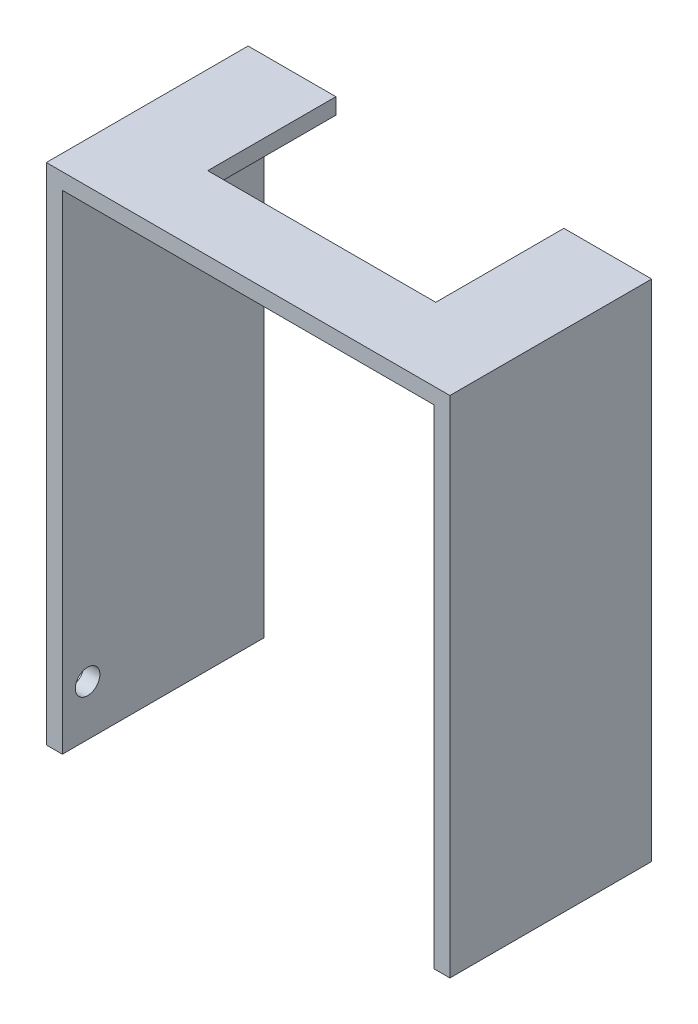
ISO-10303-21;
HEADER;
FILE_DESCRIPTION(('STEP AP214'),'2;1');
FILE_NAME('part.step','',(''),(''),'','','');
FILE_SCHEMA(('AUTOMOTIVE_DESIGN { 1 0 10303 214 1 1 1 1 }'));
ENDSEC;
DATA;
#1=APPLICATION_CONTEXT('core data for automotive mechanical design processes');
#2=APPLICATION_PROTOCOL_DEFINITION('international standard','automotive_design',2000,#1);
#3=PRODUCT_CONTEXT('',#1,'mechanical');
#4=PRODUCT('Part','Part','',(#3));
#5=PRODUCT_RELATED_PRODUCT_CATEGORY('part','',(#4));
#6=PRODUCT_DEFINITION_FORMATION('','',#4);
#7=PRODUCT_DEFINITION_CONTEXT('part definition',#1,'design');
#8=PRODUCT_DEFINITION('design','',#6,#7);
#9=PRODUCT_DEFINITION_SHAPE('','',#8);
#10=(LENGTH_UNIT() NAMED_UNIT(*) SI_UNIT(.MILLI.,.METRE.));
#11=(NAMED_UNIT(*) PLANE_ANGLE_UNIT() SI_UNIT($,.RADIAN.));
#12=(NAMED_UNIT(*) SI_UNIT($,.STERADIAN.) SOLID_ANGLE_UNIT());
#13=UNCERTAINTY_MEASURE_WITH_UNIT(LENGTH_MEASURE(1.E-05),#10,'distance_accuracy_value','');
#14=(GEOMETRIC_REPRESENTATION_CONTEXT(3) GLOBAL_UNCERTAINTY_ASSIGNED_CONTEXT((#13)) GLOBAL_UNIT_ASSIGNED_CONTEXT((#10,
#11,#12)) REPRESENTATION_CONTEXT('',''));
#15=CARTESIAN_POINT('',(0.,0.,0.));
#16=DIRECTION('',(0.,0.,1.));
#17=DIRECTION('',(1.,0.,0.));
#18=AXIS2_PLACEMENT_3D('',#15,#16,#17);
#19=CARTESIAN_POINT('',(1.59,-50.,20.));
#20=DIRECTION('',(-1.,0.,0.));
#21=DIRECTION('',(0.,0.,1.));
#22=AXIS2_PLACEMENT_3D('',#19,#20,#21);
#23=PLANE('',#22);
#24=CARTESIAN_POINT('',(1.59,-5.,2.5));
#25=DIRECTION('',(-1.,0.,0.));
#26=DIRECTION('',(0.,0.,1.));
#27=AXIS2_PLACEMENT_3D('',#24,#25,#26);
#28=CIRCLE('',#27,1.21919999999999);
#29=CARTESIAN_POINT('',(1.59,-5.,3.71919999999999));
#30=VERTEX_POINT('',#29);
#31=EDGE_CURVE('E303',#30,#30,#28,.F.);
#32=ORIENTED_EDGE('',*,*,#31,.F.);
#33=EDGE_LOOP('',(#32));
#34=FACE_BOUND('',#33,.T.);
#35=DIRECTION('',(0.,1.,0.));
#36=VECTOR('',#35,1.);
#37=CARTESIAN_POINT('',(1.59,-50.,0.));
#38=LINE('',#37,#36);
#39=CARTESIAN_POINT('',(1.59,-50.,0.));
#40=VERTEX_POINT('',#39);
#41=CARTESIAN_POINT('',(1.59,-1.59,0.));
#42=VERTEX_POINT('',#41);
#43=EDGE_CURVE('E147',#40,#42,#38,.T.);
#44=ORIENTED_EDGE('',*,*,#43,.T.);
#45=DIRECTION('',(0.,0.,-1.));
#46=VECTOR('',#45,1.);
#47=CARTESIAN_POINT('',(1.59,-1.59,20.));
#48=LINE('',#47,#46);
#49=CARTESIAN_POINT('',(1.59,-1.59,20.));
#50=VERTEX_POINT('',#49);
#51=EDGE_CURVE('E173',#50,#42,#48,.T.);
#52=ORIENTED_EDGE('',*,*,#51,.F.);
#53=DIRECTION('',(0.,1.,0.));
#54=VECTOR('',#53,1.);
#55=CARTESIAN_POINT('',(1.59,-50.,20.));
#56=LINE('',#55,#54);
#57=CARTESIAN_POINT('',(1.59,-50.,20.));
#58=VERTEX_POINT('',#57);
#59=EDGE_CURVE('E100',#58,#50,#56,.T.);
#60=ORIENTED_EDGE('',*,*,#59,.F.);
#61=DIRECTION('',(0.,0.,-1.));
#62=VECTOR('',#61,1.);
#63=CARTESIAN_POINT('',(1.59,-50.,20.));
#64=LINE('',#63,#62);
#65=EDGE_CURVE('E176',#58,#40,#64,.T.);
#66=ORIENTED_EDGE('',*,*,#65,.T.);
#67=EDGE_LOOP('',(#44,#52,#60,#66));
#68=FACE_BOUND('',#67,.T.);
#69=CARTESIAN_POINT('',(1.59,-45.,17.5));
#70=DIRECTION('',(-1.,0.,0.));
#71=DIRECTION('',(0.,0.,1.));
#72=AXIS2_PLACEMENT_3D('',#69,#70,#71);
#73=CIRCLE('',#72,1.21919999999999);
#74=CARTESIAN_POINT('',(1.59,-45.,18.7192));
#75=VERTEX_POINT('',#74);
#76=EDGE_CURVE('E310',#75,#75,#73,.F.);
#77=ORIENTED_EDGE('',*,*,#76,.F.);
#78=EDGE_LOOP('',(#77));
#79=FACE_BOUND('',#78,.T.);
#80=ADVANCED_FACE('F34',(#34,#68,#79),#23,.F.);
#81=CARTESIAN_POINT('',(0.,0.,0.));
#82=DIRECTION('',(0.,0.,1.));
#83=DIRECTION('',(1.,0.,0.));
#84=AXIS2_PLACEMENT_3D('',#81,#82,#83);
#85=PLANE('',#84);
#86=DIRECTION('',(1.,0.,0.));
#87=VECTOR('',#86,1.);
#88=CARTESIAN_POINT('',(1.59,-1.59,0.));
#89=LINE('',#88,#87);
#90=CARTESIAN_POINT('',(31.3,-1.59,0.));
#91=VERTEX_POINT('',#90);
#92=CARTESIAN_POINT('',(38.41,-1.59,0.));
#93=VERTEX_POINT('',#92);
#94=EDGE_CURVE('E150',#91,#93,#89,.T.);
#95=ORIENTED_EDGE('',*,*,#94,.F.);
#96=DIRECTION('',(0.,1.,0.));
#97=VECTOR('',#96,1.);
#98=CARTESIAN_POINT('',(31.3,0.,0.));
#99=LINE('',#98,#97);
#100=CARTESIAN_POINT('',(31.3,0.,0.));
#101=VERTEX_POINT('',#100);
#102=EDGE_CURVE('E11',#91,#101,#99,.T.);
#103=ORIENTED_EDGE('',*,*,#102,.T.);
#104=DIRECTION('',(-1.,0.,0.));
#105=VECTOR('',#104,1.);
#106=CARTESIAN_POINT('',(0.,0.,0.));
#107=LINE('',#106,#105);
#108=CARTESIAN_POINT('',(40.,0.,0.));
#109=VERTEX_POINT('',#108);
#110=EDGE_CURVE('E160',#109,#101,#107,.T.);
#111=ORIENTED_EDGE('',*,*,#110,.F.);
#112=DIRECTION('',(0.,1.,0.));
#113=VECTOR('',#112,1.);
#114=CARTESIAN_POINT('',(40.,0.,0.));
#115=LINE('',#114,#113);
#116=CARTESIAN_POINT('',(40.,-50.,0.));
#117=VERTEX_POINT('',#116);
#118=EDGE_CURVE('E131',#117,#109,#115,.T.);
#119=ORIENTED_EDGE('',*,*,#118,.F.);
#120=DIRECTION('',(1.,0.,0.));
#121=VECTOR('',#120,1.);
#122=CARTESIAN_POINT('',(38.41,-50.,0.));
#123=LINE('',#122,#121);
#124=CARTESIAN_POINT('',(38.41,-50.,0.));
#125=VERTEX_POINT('',#124);
#126=EDGE_CURVE('E156',#125,#117,#123,.T.);
#127=ORIENTED_EDGE('',*,*,#126,.F.);
#128=DIRECTION('',(0.,-1.,0.));
#129=VECTOR('',#128,1.);
#130=CARTESIAN_POINT('',(38.41,-1.59,0.));
#131=LINE('',#130,#129);
#132=EDGE_CURVE('E154',#93,#125,#131,.T.);
#133=ORIENTED_EDGE('',*,*,#132,.F.);
#134=EDGE_LOOP('',(#95,#103,#111,#119,#127,#133));
#135=FACE_BOUND('',#134,.T.);
#136=ADVANCED_FACE('F211',(#135),#85,.F.);
#137=CARTESIAN_POINT('',(0.,-50.,20.));
#138=DIRECTION('',(0.,1.,0.));
#139=DIRECTION('',(0.,0.,1.));
#140=AXIS2_PLACEMENT_3D('',#137,#138,#139);
#141=PLANE('',#140);
#142=DIRECTION('',(1.,0.,0.));
#143=VECTOR('',#142,1.);
#144=CARTESIAN_POINT('',(0.,-50.,0.));
#145=LINE('',#144,#143);
#146=CARTESIAN_POINT('',(0.,-50.,0.));
#147=VERTEX_POINT('',#146);
#148=EDGE_CURVE('E144',#147,#40,#145,.T.);
#149=ORIENTED_EDGE('',*,*,#148,.T.);
#150=ORIENTED_EDGE('',*,*,#65,.F.);
#151=DIRECTION('',(1.,0.,0.));
#152=VECTOR('',#151,1.);
#153=CARTESIAN_POINT('',(0.,-50.,20.));
#154=LINE('',#153,#152);
#155=CARTESIAN_POINT('',(0.,-50.,20.));
#156=VERTEX_POINT('',#155);
#157=EDGE_CURVE('E163',#156,#58,#154,.T.);
#158=ORIENTED_EDGE('',*,*,#157,.F.);
#159=DIRECTION('',(0.,0.,-1.));
#160=VECTOR('',#159,1.);
#161=CARTESIAN_POINT('',(0.,-50.,20.));
#162=LINE('',#161,#160);
#163=EDGE_CURVE('E140',#156,#147,#162,.T.);
#164=ORIENTED_EDGE('',*,*,#163,.T.);
#165=EDGE_LOOP('',(#149,#150,#158,#164));
#166=FACE_BOUND('',#165,.T.);
#167=ADVANCED_FACE('F36',(#166),#141,.F.);
#168=CARTESIAN_POINT('',(1.59,-1.59,20.));
#169=DIRECTION('',(0.,1.,0.));
#170=DIRECTION('',(0.,0.,1.));
#171=AXIS2_PLACEMENT_3D('',#168,#169,#170);
#172=PLANE('',#171);
#173=DIRECTION('',(1.,0.,0.));
#174=VECTOR('',#173,1.);
#175=CARTESIAN_POINT('',(1.59,-1.59,12.7));
#176=LINE('',#175,#174);
#177=CARTESIAN_POINT('',(8.7,-1.59,12.7));
#178=VERTEX_POINT('',#177);
#179=CARTESIAN_POINT('',(31.3,-1.59,12.7));
#180=VERTEX_POINT('',#179);
#181=EDGE_CURVE('E148',#178,#180,#176,.T.);
#182=ORIENTED_EDGE('',*,*,#181,.T.);
#183=DIRECTION('',(0.,0.,-1.));
#184=VECTOR('',#183,1.);
#185=CARTESIAN_POINT('',(31.3,-1.59,20.));
#186=LINE('',#185,#184);
#187=EDGE_CURVE('E330',#180,#91,#186,.T.);
#188=ORIENTED_EDGE('',*,*,#187,.T.);
#189=ORIENTED_EDGE('',*,*,#94,.T.);
#190=DIRECTION('',(0.,0.,-1.));
#191=VECTOR('',#190,1.);
#192=CARTESIAN_POINT('',(38.41,-1.59,20.));
#193=LINE('',#192,#191);
#194=CARTESIAN_POINT('',(38.41,-1.59,20.));
#195=VERTEX_POINT('',#194);
#196=EDGE_CURVE('E170',#195,#93,#193,.T.);
#197=ORIENTED_EDGE('',*,*,#196,.F.);
#198=DIRECTION('',(1.,0.,0.));
#199=VECTOR('',#198,1.);
#200=CARTESIAN_POINT('',(1.59,-1.59,20.));
#201=LINE('',#200,#199);
#202=EDGE_CURVE('E190',#50,#195,#201,.T.);
#203=ORIENTED_EDGE('',*,*,#202,.F.);
#204=ORIENTED_EDGE('',*,*,#51,.T.);
#205=CARTESIAN_POINT('',(8.7,-1.59,0.));
#206=VERTEX_POINT('',#205);
#207=EDGE_CURVE('E151',#42,#206,#89,.T.);
#208=ORIENTED_EDGE('',*,*,#207,.T.);
#209=DIRECTION('',(0.,0.,1.));
#210=VECTOR('',#209,1.);
#211=CARTESIAN_POINT('',(8.7,-1.59,20.));
#212=LINE('',#211,#210);
#213=EDGE_CURVE('E49',#206,#178,#212,.T.);
#214=ORIENTED_EDGE('',*,*,#213,.T.);
#215=EDGE_LOOP('',(#182,#188,#189,#197,#203,#204,#208,#214));
#216=FACE_BOUND('',#215,.T.);
#217=ADVANCED_FACE('F186',(#216),#172,.F.);
#218=CARTESIAN_POINT('',(38.41,-1.59,20.));
#219=DIRECTION('',(1.,0.,0.));
#220=DIRECTION('',(0.,1.,0.));
#221=AXIS2_PLACEMENT_3D('',#218,#219,#220);
#222=PLANE('',#221);
#223=ORIENTED_EDGE('',*,*,#132,.T.);
#224=DIRECTION('',(0.,0.,-1.));
#225=VECTOR('',#224,1.);
#226=CARTESIAN_POINT('',(38.41,-50.,20.));
#227=LINE('',#226,#225);
#228=CARTESIAN_POINT('',(38.41,-50.,20.));
#229=VERTEX_POINT('',#228);
#230=EDGE_CURVE('E167',#229,#125,#227,.T.);
#231=ORIENTED_EDGE('',*,*,#230,.F.);
#232=DIRECTION('',(0.,-1.,0.));
#233=VECTOR('',#232,1.);
#234=CARTESIAN_POINT('',(38.41,-1.59,20.));
#235=LINE('',#234,#233);
#236=EDGE_CURVE('E337',#195,#229,#235,.T.);
#237=ORIENTED_EDGE('',*,*,#236,.F.);
#238=ORIENTED_EDGE('',*,*,#196,.T.);
#239=EDGE_LOOP('',(#223,#231,#237,#238));
#240=FACE_BOUND('',#239,.T.);
#241=ADVANCED_FACE('F222',(#240),#222,.F.);
#242=CARTESIAN_POINT('',(38.41,-50.,20.));
#243=DIRECTION('',(0.,1.,0.));
#244=DIRECTION('',(0.,0.,1.));
#245=AXIS2_PLACEMENT_3D('',#242,#243,#244);
#246=PLANE('',#245);
#247=ORIENTED_EDGE('',*,*,#126,.T.);
#248=DIRECTION('',(0.,0.,-1.));
#249=VECTOR('',#248,1.);
#250=CARTESIAN_POINT('',(40.,-50.,20.));
#251=LINE('',#250,#249);
#252=CARTESIAN_POINT('',(40.,-50.,20.));
#253=VERTEX_POINT('',#252);
#254=EDGE_CURVE('E135',#253,#117,#251,.T.);
#255=ORIENTED_EDGE('',*,*,#254,.F.);
#256=DIRECTION('',(1.,0.,0.));
#257=VECTOR('',#256,1.);
#258=CARTESIAN_POINT('',(38.41,-50.,20.));
#259=LINE('',#258,#257);
#260=EDGE_CURVE('E122',#229,#253,#259,.T.);
#261=ORIENTED_EDGE('',*,*,#260,.F.);
#262=ORIENTED_EDGE('',*,*,#230,.T.);
#263=EDGE_LOOP('',(#247,#255,#261,#262));
#264=FACE_BOUND('',#263,.T.);
#265=ADVANCED_FACE('F225',(#264),#246,.F.);
#266=CARTESIAN_POINT('',(40.,0.,20.));
#267=DIRECTION('',(-1.,0.,0.));
#268=DIRECTION('',(0.,-1.,0.));
#269=AXIS2_PLACEMENT_3D('',#266,#267,#268);
#270=PLANE('',#269);
#271=ORIENTED_EDGE('',*,*,#118,.T.);
#272=DIRECTION('',(0.,0.,-1.));
#273=VECTOR('',#272,1.);
#274=CARTESIAN_POINT('',(40.,0.,20.));
#275=LINE('',#274,#273);
#276=CARTESIAN_POINT('',(40.,0.,20.));
#277=VERTEX_POINT('',#276);
#278=EDGE_CURVE('E128',#277,#109,#275,.T.);
#279=ORIENTED_EDGE('',*,*,#278,.F.);
#280=DIRECTION('',(0.,1.,0.));
#281=VECTOR('',#280,1.);
#282=CARTESIAN_POINT('',(40.,0.,20.));
#283=LINE('',#282,#281);
#284=EDGE_CURVE('E115',#253,#277,#283,.T.);
#285=ORIENTED_EDGE('',*,*,#284,.F.);
#286=ORIENTED_EDGE('',*,*,#254,.T.);
#287=EDGE_LOOP('',(#271,#279,#285,#286));
#288=FACE_BOUND('',#287,.T.);
#289=ADVANCED_FACE('F129',(#288),#270,.F.);
#290=CARTESIAN_POINT('',(0.,0.,20.));
#291=DIRECTION('',(0.,-1.,0.));
#292=DIRECTION('',(0.,0.,-1.));
#293=AXIS2_PLACEMENT_3D('',#290,#291,#292);
#294=PLANE('',#293);
#295=ORIENTED_EDGE('',*,*,#110,.T.);
#296=DIRECTION('',(0.,0.,-1.));
#297=VECTOR('',#296,1.);
#298=CARTESIAN_POINT('',(31.3,0.,12.7));
#299=LINE('',#298,#297);
#300=CARTESIAN_POINT('',(31.3,0.,12.7));
#301=VERTEX_POINT('',#300);
#302=EDGE_CURVE('E320',#301,#101,#299,.T.);
#303=ORIENTED_EDGE('',*,*,#302,.F.);
#304=DIRECTION('',(1.,0.,0.));
#305=VECTOR('',#304,1.);
#306=CARTESIAN_POINT('',(8.7,0.,12.7));
#307=LINE('',#306,#305);
#308=CARTESIAN_POINT('',(8.7,0.,12.7));
#309=VERTEX_POINT('',#308);
#310=EDGE_CURVE('E317',#309,#301,#307,.T.);
#311=ORIENTED_EDGE('',*,*,#310,.F.);
#312=DIRECTION('',(0.,0.,1.));
#313=VECTOR('',#312,1.);
#314=CARTESIAN_POINT('',(8.7,0.,0.));
#315=LINE('',#314,#313);
#316=CARTESIAN_POINT('',(8.7,0.,0.));
#317=VERTEX_POINT('',#316);
#318=EDGE_CURVE('E313',#317,#309,#315,.T.);
#319=ORIENTED_EDGE('',*,*,#318,.F.);
#320=CARTESIAN_POINT('',(0.,0.,0.));
#321=VERTEX_POINT('',#320);
#322=EDGE_CURVE('E159',#317,#321,#107,.T.);
#323=ORIENTED_EDGE('',*,*,#322,.T.);
#324=DIRECTION('',(0.,0.,-1.));
#325=VECTOR('',#324,1.);
#326=CARTESIAN_POINT('',(0.,0.,20.));
#327=LINE('',#326,#325);
#328=CARTESIAN_POINT('',(0.,0.,20.));
#329=VERTEX_POINT('',#328);
#330=EDGE_CURVE('E136',#329,#321,#327,.T.);
#331=ORIENTED_EDGE('',*,*,#330,.F.);
#332=DIRECTION('',(-1.,0.,0.));
#333=VECTOR('',#332,1.);
#334=CARTESIAN_POINT('',(0.,0.,20.));
#335=LINE('',#334,#333);
#336=EDGE_CURVE('E119',#277,#329,#335,.T.);
#337=ORIENTED_EDGE('',*,*,#336,.F.);
#338=ORIENTED_EDGE('',*,*,#278,.T.);
#339=EDGE_LOOP('',(#295,#303,#311,#319,#323,#331,#337,#338));
#340=FACE_BOUND('',#339,.T.);
#341=ADVANCED_FACE('F138',(#340),#294,.F.);
#342=CARTESIAN_POINT('',(0.,-50.,20.));
#343=DIRECTION('',(1.,0.,0.));
#344=DIRECTION('',(0.,0.,-1.));
#345=AXIS2_PLACEMENT_3D('',#342,#343,#344);
#346=PLANE('',#345);
#347=CARTESIAN_POINT('',(0.,-5.,2.5));
#348=DIRECTION('',(-1.,0.,0.));
#349=DIRECTION('',(0.,0.,1.));
#350=AXIS2_PLACEMENT_3D('',#347,#348,#349);
#351=CIRCLE('',#350,1.21919999999999);
#352=CARTESIAN_POINT('',(0.,-5.,3.71919999999999));
#353=VERTEX_POINT('',#352);
#354=EDGE_CURVE('E305',#353,#353,#351,.T.);
#355=ORIENTED_EDGE('',*,*,#354,.F.);
#356=EDGE_LOOP('',(#355));
#357=FACE_BOUND('',#356,.T.);
#358=CARTESIAN_POINT('',(0.,-45.,17.5));
#359=DIRECTION('',(-1.,0.,0.));
#360=DIRECTION('',(0.,0.,1.));
#361=AXIS2_PLACEMENT_3D('',#358,#359,#360);
#362=CIRCLE('',#361,1.21919999999999);
#363=CARTESIAN_POINT('',(0.,-45.,18.7192));
#364=VERTEX_POINT('',#363);
#365=EDGE_CURVE('E307',#364,#364,#362,.T.);
#366=ORIENTED_EDGE('',*,*,#365,.F.);
#367=EDGE_LOOP('',(#366));
#368=FACE_BOUND('',#367,.T.);
#369=DIRECTION('',(0.,-1.,0.));
#370=VECTOR('',#369,1.);
#371=CARTESIAN_POINT('',(0.,-50.,0.));
#372=LINE('',#371,#370);
#373=EDGE_CURVE('E91',#321,#147,#372,.T.);
#374=ORIENTED_EDGE('',*,*,#373,.T.);
#375=ORIENTED_EDGE('',*,*,#163,.F.);
#376=DIRECTION('',(0.,-1.,0.));
#377=VECTOR('',#376,1.);
#378=CARTESIAN_POINT('',(0.,-50.,20.));
#379=LINE('',#378,#377);
#380=EDGE_CURVE('E58',#329,#156,#379,.T.);
#381=ORIENTED_EDGE('',*,*,#380,.F.);
#382=ORIENTED_EDGE('',*,*,#330,.T.);
#383=EDGE_LOOP('',(#374,#375,#381,#382));
#384=FACE_BOUND('',#383,.T.);
#385=ADVANCED_FACE('F196',(#357,#368,#384),#346,.F.);
#386=CARTESIAN_POINT('',(0.,0.,20.));
#387=DIRECTION('',(0.,0.,1.));
#388=DIRECTION('',(1.,0.,0.));
#389=AXIS2_PLACEMENT_3D('',#386,#387,#388);
#390=PLANE('',#389);
#391=ORIENTED_EDGE('',*,*,#157,.T.);
#392=ORIENTED_EDGE('',*,*,#59,.T.);
#393=ORIENTED_EDGE('',*,*,#202,.T.);
#394=ORIENTED_EDGE('',*,*,#236,.T.);
#395=ORIENTED_EDGE('',*,*,#260,.T.);
#396=ORIENTED_EDGE('',*,*,#284,.T.);
#397=ORIENTED_EDGE('',*,*,#336,.T.);
#398=ORIENTED_EDGE('',*,*,#380,.T.);
#399=EDGE_LOOP('',(#391,#392,#393,#394,#395,#396,#397,#398));
#400=FACE_BOUND('',#399,.T.);
#401=ADVANCED_FACE('F117',(#400),#390,.T.);
#402=ORIENTED_EDGE('',*,*,#322,.F.);
#403=DIRECTION('',(0.,-1.,0.));
#404=VECTOR('',#403,1.);
#405=CARTESIAN_POINT('',(8.7,0.,0.));
#406=LINE('',#405,#404);
#407=EDGE_CURVE('E42',#317,#206,#406,.T.);
#408=ORIENTED_EDGE('',*,*,#407,.T.);
#409=ORIENTED_EDGE('',*,*,#207,.F.);
#410=ORIENTED_EDGE('',*,*,#43,.F.);
#411=ORIENTED_EDGE('',*,*,#148,.F.);
#412=ORIENTED_EDGE('',*,*,#373,.F.);
#413=EDGE_LOOP('',(#402,#408,#409,#410,#411,#412));
#414=FACE_BOUND('',#413,.T.);
#415=ADVANCED_FACE('F180',(#414),#85,.F.);
#416=CARTESIAN_POINT('',(8.7,-10.,12.7));
#417=DIRECTION('',(0.,0.,1.));
#418=DIRECTION('',(1.,0.,0.));
#419=AXIS2_PLACEMENT_3D('',#416,#417,#418);
#420=PLANE('',#419);
#421=DIRECTION('',(0.,1.,0.));
#422=VECTOR('',#421,1.);
#423=CARTESIAN_POINT('',(8.7,-10.,12.7));
#424=LINE('',#423,#422);
#425=EDGE_CURVE('E323',#178,#309,#424,.T.);
#426=ORIENTED_EDGE('',*,*,#425,.T.);
#427=ORIENTED_EDGE('',*,*,#310,.T.);
#428=DIRECTION('',(0.,1.,0.));
#429=VECTOR('',#428,1.);
#430=CARTESIAN_POINT('',(31.3,-10.,12.7));
#431=LINE('',#430,#429);
#432=EDGE_CURVE('E324',#180,#301,#431,.T.);
#433=ORIENTED_EDGE('',*,*,#432,.F.);
#434=ORIENTED_EDGE('',*,*,#181,.F.);
#435=EDGE_LOOP('',(#426,#427,#433,#434));
#436=FACE_BOUND('',#435,.T.);
#437=ADVANCED_FACE('F255',(#436),#420,.F.);
#438=CARTESIAN_POINT('',(31.3,-10.,12.7));
#439=DIRECTION('',(1.,0.,0.));
#440=DIRECTION('',(0.,0.,-1.));
#441=AXIS2_PLACEMENT_3D('',#438,#439,#440);
#442=PLANE('',#441);
#443=ORIENTED_EDGE('',*,*,#432,.T.);
#444=ORIENTED_EDGE('',*,*,#302,.T.);
#445=ORIENTED_EDGE('',*,*,#102,.F.);
#446=ORIENTED_EDGE('',*,*,#187,.F.);
#447=EDGE_LOOP('',(#443,#444,#445,#446));
#448=FACE_BOUND('',#447,.T.);
#449=ADVANCED_FACE('F261',(#448),#442,.F.);
#450=CARTESIAN_POINT('',(8.7,-10.,0.));
#451=DIRECTION('',(-1.,0.,0.));
#452=DIRECTION('',(0.,0.,1.));
#453=AXIS2_PLACEMENT_3D('',#450,#451,#452);
#454=PLANE('',#453);
#455=ORIENTED_EDGE('',*,*,#407,.F.);
#456=ORIENTED_EDGE('',*,*,#318,.T.);
#457=ORIENTED_EDGE('',*,*,#425,.F.);
#458=ORIENTED_EDGE('',*,*,#213,.F.);
#459=EDGE_LOOP('',(#455,#456,#457,#458));
#460=FACE_BOUND('',#459,.T.);
#461=ADVANCED_FACE('F269',(#460),#454,.F.);
#462=CARTESIAN_POINT('',(0.,-45.,17.5));
#463=DIRECTION('',(-1.,0.,0.));
#464=DIRECTION('',(0.,0.,1.));
#465=AXIS2_PLACEMENT_3D('',#462,#463,#464);
#466=CYLINDRICAL_SURFACE('',#465,1.21919999999999);
#467=ORIENTED_EDGE('',*,*,#76,.T.);
#468=EDGE_LOOP('',(#467));
#469=FACE_BOUND('',#468,.T.);
#470=ORIENTED_EDGE('',*,*,#365,.T.);
#471=EDGE_LOOP('',(#470));
#472=FACE_BOUND('',#471,.T.);
#473=ADVANCED_FACE('F276',(#469,#472),#466,.F.);
#474=CARTESIAN_POINT('',(0.,-5.,2.5));
#475=DIRECTION('',(-1.,0.,0.));
#476=DIRECTION('',(0.,0.,1.));
#477=AXIS2_PLACEMENT_3D('',#474,#475,#476);
#478=CYLINDRICAL_SURFACE('',#477,1.21919999999999);
#479=ORIENTED_EDGE('',*,*,#31,.T.);
#480=EDGE_LOOP('',(#479));
#481=FACE_BOUND('',#480,.T.);
#482=ORIENTED_EDGE('',*,*,#354,.T.);
#483=EDGE_LOOP('',(#482));
#484=FACE_BOUND('',#483,.T.);
#485=ADVANCED_FACE('F287',(#481,#484),#478,.F.);
#486=CLOSED_SHELL('',(#80,#136,#167,#217,#241,#265,#289,#341,#385,#401,#415,#437,#449,#461,#473,#485));
#487=MANIFOLD_SOLID_BREP('B2',#486);
#488=ADVANCED_BREP_SHAPE_REPRESENTATION('',(#18,#487),#14);
#489=SHAPE_DEFINITION_REPRESENTATION(#9,#488);
ENDSEC;
END-ISO-10303-21;
